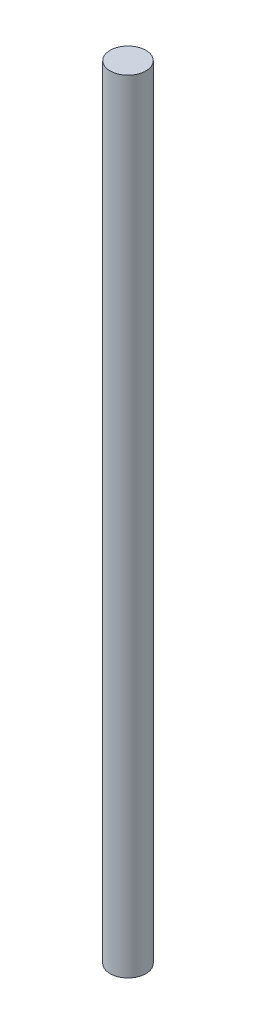
ISO-10303-21;
HEADER;
FILE_DESCRIPTION(('STEP AP214'),'2;1');
FILE_NAME('part.step','',(''),(''),'','','');
FILE_SCHEMA(('AUTOMOTIVE_DESIGN { 1 0 10303 214 1 1 1 1 }'));
ENDSEC;
DATA;
#1=APPLICATION_CONTEXT('core data for automotive mechanical design processes');
#2=APPLICATION_PROTOCOL_DEFINITION('international standard','automotive_design',2000,#1);
#3=PRODUCT_CONTEXT('',#1,'mechanical');
#4=PRODUCT('Part','Part','',(#3));
#5=PRODUCT_RELATED_PRODUCT_CATEGORY('part','',(#4));
#6=PRODUCT_DEFINITION_FORMATION('','',#4);
#7=PRODUCT_DEFINITION_CONTEXT('part definition',#1,'design');
#8=PRODUCT_DEFINITION('design','',#6,#7);
#9=PRODUCT_DEFINITION_SHAPE('','',#8);
#10=(LENGTH_UNIT() NAMED_UNIT(*) SI_UNIT(.MILLI.,.METRE.));
#11=(NAMED_UNIT(*) PLANE_ANGLE_UNIT() SI_UNIT($,.RADIAN.));
#12=(NAMED_UNIT(*) SI_UNIT($,.STERADIAN.) SOLID_ANGLE_UNIT());
#13=UNCERTAINTY_MEASURE_WITH_UNIT(LENGTH_MEASURE(1.E-05),#10,'distance_accuracy_value','');
#14=(GEOMETRIC_REPRESENTATION_CONTEXT(3) GLOBAL_UNCERTAINTY_ASSIGNED_CONTEXT((#13)) GLOBAL_UNIT_ASSIGNED_CONTEXT((#10,
#11,#12)) REPRESENTATION_CONTEXT('',''));
#15=CARTESIAN_POINT('',(0.,0.,0.));
#16=DIRECTION('',(0.,0.,1.));
#17=DIRECTION('',(1.,0.,0.));
#18=AXIS2_PLACEMENT_3D('',#15,#16,#17);
#19=CARTESIAN_POINT('',(0.,175.,0.));
#20=DIRECTION('',(0.,-1.,0.));
#21=DIRECTION('',(0.,0.,-1.));
#22=AXIS2_PLACEMENT_3D('',#19,#20,#21);
#23=CYLINDRICAL_SURFACE('',#22,4.);
#24=CARTESIAN_POINT('',(0.,175.,0.));
#25=DIRECTION('',(0.,1.,0.));
#26=DIRECTION('',(0.,0.,1.));
#27=AXIS2_PLACEMENT_3D('',#24,#25,#26);
#28=CIRCLE('',#27,4.);
#29=CARTESIAN_POINT('',(0.,175.,4.));
#30=VERTEX_POINT('',#29);
#31=EDGE_CURVE('E12',#30,#30,#28,.T.);
#32=ORIENTED_EDGE('',*,*,#31,.F.);
#33=EDGE_LOOP('',(#32));
#34=FACE_BOUND('',#33,.T.);
#35=CARTESIAN_POINT('',(0.,0.,0.));
#36=DIRECTION('',(0.,1.,0.));
#37=DIRECTION('',(0.,0.,1.));
#38=AXIS2_PLACEMENT_3D('',#35,#36,#37);
#39=CIRCLE('',#38,4.);
#40=CARTESIAN_POINT('',(0.,0.,4.));
#41=VERTEX_POINT('',#40);
#42=EDGE_CURVE('E45',#41,#41,#39,.T.);
#43=ORIENTED_EDGE('',*,*,#42,.T.);
#44=EDGE_LOOP('',(#43));
#45=FACE_BOUND('',#44,.T.);
#46=ADVANCED_FACE('F42',(#34,#45),#23,.T.);
#47=CARTESIAN_POINT('',(0.,175.,0.));
#48=DIRECTION('',(0.,1.,0.));
#49=DIRECTION('',(0.,0.,1.));
#50=AXIS2_PLACEMENT_3D('',#47,#48,#49);
#51=PLANE('',#50);
#52=ORIENTED_EDGE('',*,*,#31,.T.);
#53=EDGE_LOOP('',(#52));
#54=FACE_BOUND('',#53,.T.);
#55=ADVANCED_FACE('F57',(#54),#51,.T.);
#56=CARTESIAN_POINT('',(0.,0.,0.));
#57=DIRECTION('',(0.,1.,0.));
#58=DIRECTION('',(0.,0.,1.));
#59=AXIS2_PLACEMENT_3D('',#56,#57,#58);
#60=PLANE('',#59);
#61=ORIENTED_EDGE('',*,*,#42,.F.);
#62=EDGE_LOOP('',(#61));
#63=FACE_BOUND('',#62,.T.);
#64=ADVANCED_FACE('F55',(#63),#60,.F.);
#65=CLOSED_SHELL('',(#46,#55,#64));
#66=MANIFOLD_SOLID_BREP('B2',#65);
#67=ADVANCED_BREP_SHAPE_REPRESENTATION('',(#18,#66),#14);
#68=SHAPE_DEFINITION_REPRESENTATION(#9,#67);
ENDSEC;
END-ISO-10303-21;
